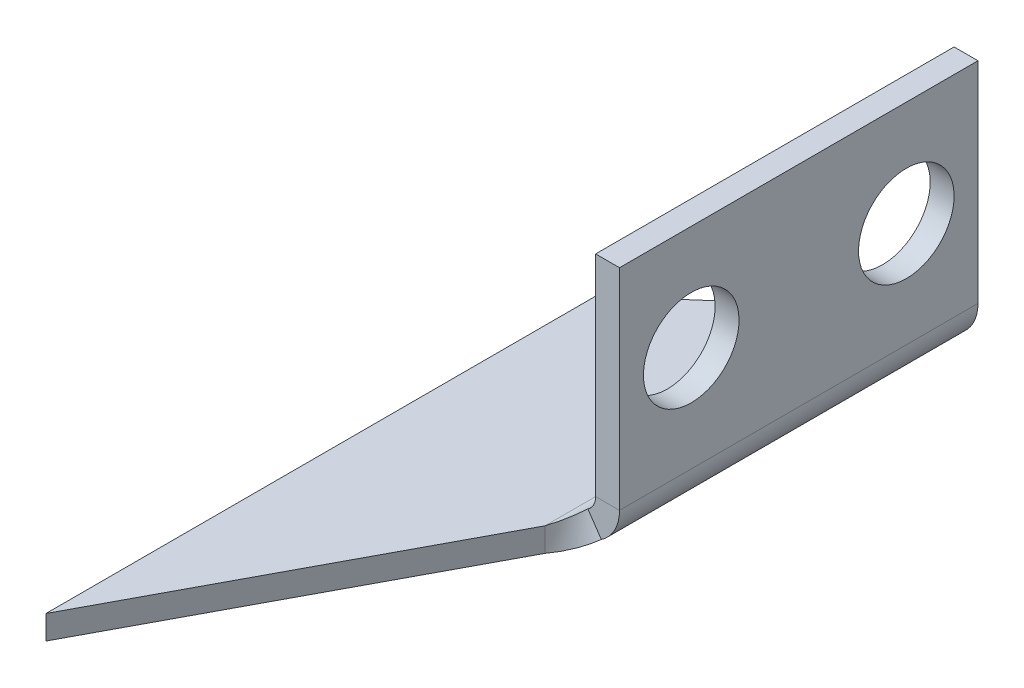
ISO-10303-21;
HEADER;
FILE_DESCRIPTION(('STEP AP214'),'2;1');
FILE_NAME('part.step','',(''),(''),'','','');
FILE_SCHEMA(('AUTOMOTIVE_DESIGN { 1 0 10303 214 1 1 1 1 }'));
ENDSEC;
DATA;
#1=APPLICATION_CONTEXT('core data for automotive mechanical design processes');
#2=APPLICATION_PROTOCOL_DEFINITION('international standard','automotive_design',2000,#1);
#3=PRODUCT_CONTEXT('',#1,'mechanical');
#4=PRODUCT('Part','Part','',(#3));
#5=PRODUCT_RELATED_PRODUCT_CATEGORY('part','',(#4));
#6=PRODUCT_DEFINITION_FORMATION('','',#4);
#7=PRODUCT_DEFINITION_CONTEXT('part definition',#1,'design');
#8=PRODUCT_DEFINITION('design','',#6,#7);
#9=PRODUCT_DEFINITION_SHAPE('','',#8);
#10=(LENGTH_UNIT() NAMED_UNIT(*) SI_UNIT(.MILLI.,.METRE.));
#11=(NAMED_UNIT(*) PLANE_ANGLE_UNIT() SI_UNIT($,.RADIAN.));
#12=(NAMED_UNIT(*) SI_UNIT($,.STERADIAN.) SOLID_ANGLE_UNIT());
#13=UNCERTAINTY_MEASURE_WITH_UNIT(LENGTH_MEASURE(1.E-05),#10,'distance_accuracy_value','');
#14=(GEOMETRIC_REPRESENTATION_CONTEXT(3) GLOBAL_UNCERTAINTY_ASSIGNED_CONTEXT((#13)) GLOBAL_UNIT_ASSIGNED_CONTEXT((#10,
#11,#12)) REPRESENTATION_CONTEXT('',''));
#15=CARTESIAN_POINT('',(0.,0.,0.));
#16=DIRECTION('',(0.,0.,1.));
#17=DIRECTION('',(1.,0.,0.));
#18=AXIS2_PLACEMENT_3D('',#15,#16,#17);
#19=CARTESIAN_POINT('',(1.00000000000001,-0.469246737714571,0.));
#20=DIRECTION('',(-1.,0.,0.));
#21=DIRECTION('',(0.,0.,1.));
#22=AXIS2_PLACEMENT_3D('',#19,#20,#21);
#23=PLANE('',#22);
#24=CARTESIAN_POINT('',(0.999999999999987,5.13367663114272,3.));
#25=DIRECTION('',(-1.,0.,0.));
#26=DIRECTION('',(0.,-1.,0.));
#27=AXIS2_PLACEMENT_3D('',#24,#25,#26);
#28=CIRCLE('',#27,2.);
#29=CARTESIAN_POINT('',(0.999999999999994,3.13367663114271,3.));
#30=VERTEX_POINT('',#29);
#31=EDGE_CURVE('E403',#30,#30,#28,.T.);
#32=ORIENTED_EDGE('',*,*,#31,.T.);
#33=EDGE_LOOP('',(#32));
#34=FACE_BOUND('',#33,.T.);
#35=CARTESIAN_POINT('',(0.999999999999987,5.13367663114272,12.));
#36=DIRECTION('',(-1.,0.,0.));
#37=DIRECTION('',(0.,-1.,0.));
#38=AXIS2_PLACEMENT_3D('',#35,#36,#37);
#39=CIRCLE('',#38,2.);
#40=CARTESIAN_POINT('',(0.999999999999994,3.13367663114272,12.));
#41=VERTEX_POINT('',#40);
#42=EDGE_CURVE('E406',#41,#41,#39,.T.);
#43=ORIENTED_EDGE('',*,*,#42,.T.);
#44=EDGE_LOOP('',(#43));
#45=FACE_BOUND('',#44,.T.);
#46=DIRECTION('',(0.,1.,0.));
#47=VECTOR('',#46,1.);
#48=CARTESIAN_POINT('',(1.00000000000001,-0.46924673771457,15.));
#49=LINE('',#48,#47);
#50=CARTESIAN_POINT('',(1.,0.736600000000008,15.));
#51=VERTEX_POINT('',#50);
#52=CARTESIAN_POINT('',(0.999999999999972,9.53075326228543,15.));
#53=VERTEX_POINT('',#52);
#54=EDGE_CURVE('E65',#51,#53,#49,.T.);
#55=ORIENTED_EDGE('',*,*,#54,.F.);
#56=DIRECTION('',(0.,0.,-1.));
#57=VECTOR('',#56,1.);
#58=CARTESIAN_POINT('',(1.,0.736600000000005,0.));
#59=LINE('',#58,#57);
#60=CARTESIAN_POINT('',(1.,0.736600000000004,0.));
#61=VERTEX_POINT('',#60);
#62=EDGE_CURVE('E105',#51,#61,#59,.T.);
#63=ORIENTED_EDGE('',*,*,#62,.T.);
#64=DIRECTION('',(0.,-1.,0.));
#65=VECTOR('',#64,1.);
#66=CARTESIAN_POINT('',(0.999999999999972,9.53075326228543,0.));
#67=LINE('',#66,#65);
#68=CARTESIAN_POINT('',(0.999999999999972,9.53075326228543,0.));
#69=VERTEX_POINT('',#68);
#70=EDGE_CURVE('E120',#69,#61,#67,.T.);
#71=ORIENTED_EDGE('',*,*,#70,.F.);
#72=DIRECTION('',(0.,0.,-1.));
#73=VECTOR('',#72,1.);
#74=CARTESIAN_POINT('',(0.999999999999972,9.53075326228543,15.));
#75=LINE('',#74,#73);
#76=EDGE_CURVE('E104',#53,#69,#75,.T.);
#77=ORIENTED_EDGE('',*,*,#76,.F.);
#78=EDGE_LOOP('',(#55,#63,#71,#77));
#79=FACE_BOUND('',#78,.T.);
#80=ADVANCED_FACE('F61',(#34,#45,#79),#23,.F.);
#81=CARTESIAN_POINT('',(0.999999999999972,9.53075326228543,0.));
#82=DIRECTION('',(0.,0.,-1.));
#83=DIRECTION('',(0.,-1.,0.));
#84=AXIS2_PLACEMENT_3D('',#81,#82,#83);
#85=PLANE('',#84);
#86=DIRECTION('',(1.,0.,0.));
#87=VECTOR('',#86,1.);
#88=CARTESIAN_POINT('',(1.,0.736600000000004,0.));
#89=LINE('',#88,#87);
#90=CARTESIAN_POINT('',(0.,0.736600000000003,0.));
#91=VERTEX_POINT('',#90);
#92=EDGE_CURVE('E12',#91,#61,#89,.T.);
#93=ORIENTED_EDGE('',*,*,#92,.F.);
#94=DIRECTION('',(0.,-1.,0.));
#95=VECTOR('',#94,1.);
#96=CARTESIAN_POINT('',(0.,9.53075326228543,0.));
#97=LINE('',#96,#95);
#98=CARTESIAN_POINT('',(0.,9.53075326228543,0.));
#99=VERTEX_POINT('',#98);
#100=EDGE_CURVE('E110',#99,#91,#97,.T.);
#101=ORIENTED_EDGE('',*,*,#100,.F.);
#102=DIRECTION('',(-1.,0.,0.));
#103=VECTOR('',#102,1.);
#104=CARTESIAN_POINT('',(0.999999999999972,9.53075326228543,0.));
#105=LINE('',#104,#103);
#106=EDGE_CURVE('E86',#69,#99,#105,.T.);
#107=ORIENTED_EDGE('',*,*,#106,.F.);
#108=ORIENTED_EDGE('',*,*,#70,.T.);
#109=EDGE_LOOP('',(#93,#101,#107,#108));
#110=FACE_BOUND('',#109,.T.);
#111=ADVANCED_FACE('F63',(#110),#85,.T.);
#112=CARTESIAN_POINT('',(0.999999999999972,9.53075326228543,15.));
#113=DIRECTION('',(0.,1.,0.));
#114=DIRECTION('',(0.,0.,-1.));
#115=AXIS2_PLACEMENT_3D('',#112,#113,#114);
#116=PLANE('',#115);
#117=DIRECTION('',(0.,0.,-1.));
#118=VECTOR('',#117,1.);
#119=CARTESIAN_POINT('',(0.,9.53075326228543,15.));
#120=LINE('',#119,#118);
#121=CARTESIAN_POINT('',(0.,9.53075326228543,15.));
#122=VERTEX_POINT('',#121);
#123=EDGE_CURVE('E102',#122,#99,#120,.T.);
#124=ORIENTED_EDGE('',*,*,#123,.F.);
#125=DIRECTION('',(-1.,0.,0.));
#126=VECTOR('',#125,1.);
#127=CARTESIAN_POINT('',(0.999999999999972,9.53075326228543,15.));
#128=LINE('',#127,#126);
#129=EDGE_CURVE('E106',#53,#122,#128,.T.);
#130=ORIENTED_EDGE('',*,*,#129,.F.);
#131=ORIENTED_EDGE('',*,*,#76,.T.);
#132=ORIENTED_EDGE('',*,*,#106,.T.);
#133=EDGE_LOOP('',(#124,#130,#131,#132));
#134=FACE_BOUND('',#133,.T.);
#135=ADVANCED_FACE('F99',(#134),#116,.T.);
#136=CARTESIAN_POINT('',(1.00000000000001,-0.46924673771457,15.));
#137=DIRECTION('',(0.,0.,1.));
#138=DIRECTION('',(0.,1.,0.));
#139=AXIS2_PLACEMENT_3D('',#136,#137,#138);
#140=PLANE('',#139);
#141=DIRECTION('',(-1.,0.,0.));
#142=VECTOR('',#141,1.);
#143=CARTESIAN_POINT('',(1.,0.736600000000006,15.));
#144=LINE('',#143,#142);
#145=CARTESIAN_POINT('',(0.,0.736600000000003,15.));
#146=VERTEX_POINT('',#145);
#147=EDGE_CURVE('E129',#51,#146,#144,.T.);
#148=ORIENTED_EDGE('',*,*,#147,.F.);
#149=ORIENTED_EDGE('',*,*,#54,.T.);
#150=ORIENTED_EDGE('',*,*,#129,.T.);
#151=DIRECTION('',(0.,1.,0.));
#152=VECTOR('',#151,1.);
#153=CARTESIAN_POINT('',(0.,-0.469246737714574,15.));
#154=LINE('',#153,#152);
#155=EDGE_CURVE('E114',#146,#122,#154,.T.);
#156=ORIENTED_EDGE('',*,*,#155,.F.);
#157=EDGE_LOOP('',(#148,#149,#150,#156));
#158=FACE_BOUND('',#157,.T.);
#159=ADVANCED_FACE('F385',(#158),#140,.T.);
#160=CARTESIAN_POINT('',(0.,-0.469246737714574,0.));
#161=DIRECTION('',(-1.,0.,0.));
#162=DIRECTION('',(0.,0.,1.));
#163=AXIS2_PLACEMENT_3D('',#160,#161,#162);
#164=PLANE('',#163);
#165=CARTESIAN_POINT('',(0.,5.13367663114271,3.));
#166=DIRECTION('',(-1.,0.,0.));
#167=DIRECTION('',(0.,-1.,0.));
#168=AXIS2_PLACEMENT_3D('',#165,#166,#167);
#169=CIRCLE('',#168,2.);
#170=CARTESIAN_POINT('',(0.,3.13367663114271,3.));
#171=VERTEX_POINT('',#170);
#172=EDGE_CURVE('E408',#171,#171,#169,.T.);
#173=ORIENTED_EDGE('',*,*,#172,.F.);
#174=EDGE_LOOP('',(#173));
#175=FACE_BOUND('',#174,.T.);
#176=CARTESIAN_POINT('',(0.,5.13367663114271,12.));
#177=DIRECTION('',(-1.,0.,0.));
#178=DIRECTION('',(0.,-1.,0.));
#179=AXIS2_PLACEMENT_3D('',#176,#177,#178);
#180=CIRCLE('',#179,2.);
#181=CARTESIAN_POINT('',(0.,3.13367663114271,12.));
#182=VERTEX_POINT('',#181);
#183=EDGE_CURVE('E412',#182,#182,#180,.T.);
#184=ORIENTED_EDGE('',*,*,#183,.F.);
#185=EDGE_LOOP('',(#184));
#186=FACE_BOUND('',#185,.T.);
#187=DIRECTION('',(0.,0.,-1.));
#188=VECTOR('',#187,1.);
#189=CARTESIAN_POINT('',(0.,0.736600000000002,0.));
#190=LINE('',#189,#188);
#191=EDGE_CURVE('E70',#146,#91,#190,.T.);
#192=ORIENTED_EDGE('',*,*,#191,.F.);
#193=ORIENTED_EDGE('',*,*,#155,.T.);
#194=ORIENTED_EDGE('',*,*,#123,.T.);
#195=ORIENTED_EDGE('',*,*,#100,.T.);
#196=EDGE_LOOP('',(#192,#193,#194,#195));
#197=FACE_BOUND('',#196,.T.);
#198=ADVANCED_FACE('F117',(#175,#186,#197),#164,.T.);
#199=CARTESIAN_POINT('',(-8.,-1.,30.));
#200=DIRECTION('',(-1.,0.,0.));
#201=DIRECTION('',(0.,0.,1.));
#202=AXIS2_PLACEMENT_3D('',#199,#200,#201);
#203=PLANE('',#202);
#204=DIRECTION('',(0.,0.,1.));
#205=VECTOR('',#204,1.);
#206=CARTESIAN_POINT('',(-8.,0.,30.));
#207=LINE('',#206,#205);
#208=CARTESIAN_POINT('',(-8.,0.,7.));
#209=VERTEX_POINT('',#208);
#210=CARTESIAN_POINT('',(-8.,0.,30.));
#211=VERTEX_POINT('',#210);
#212=EDGE_CURVE('E277',#209,#211,#207,.T.);
#213=ORIENTED_EDGE('',*,*,#212,.F.);
#214=DIRECTION('',(0.,1.,0.));
#215=VECTOR('',#214,1.);
#216=CARTESIAN_POINT('',(-8.,-1.,7.));
#217=LINE('',#216,#215);
#218=CARTESIAN_POINT('',(-8.,-1.,7.));
#219=VERTEX_POINT('',#218);
#220=EDGE_CURVE('E115',#219,#209,#217,.T.);
#221=ORIENTED_EDGE('',*,*,#220,.F.);
#222=DIRECTION('',(0.,0.,1.));
#223=VECTOR('',#222,1.);
#224=CARTESIAN_POINT('',(-8.,-1.,7.));
#225=LINE('',#224,#223);
#226=CARTESIAN_POINT('',(-8.,-1.,30.));
#227=VERTEX_POINT('',#226);
#228=EDGE_CURVE('E286',#219,#227,#225,.T.);
#229=ORIENTED_EDGE('',*,*,#228,.T.);
#230=DIRECTION('',(0.,1.,0.));
#231=VECTOR('',#230,1.);
#232=CARTESIAN_POINT('',(-8.,-1.,30.));
#233=LINE('',#232,#231);
#234=EDGE_CURVE('E282',#227,#211,#233,.T.);
#235=ORIENTED_EDGE('',*,*,#234,.T.);
#236=EDGE_LOOP('',(#213,#221,#229,#235));
#237=FACE_BOUND('',#236,.T.);
#238=ADVANCED_FACE('F263',(#237),#203,.T.);
#239=CARTESIAN_POINT('',(0.,-1.,0.));
#240=DIRECTION('',(0.,1.,0.));
#241=DIRECTION('',(0.,0.,1.));
#242=AXIS2_PLACEMENT_3D('',#239,#240,#241);
#243=PLANE('',#242);
#244=DIRECTION('',(0.,0.,-1.));
#245=VECTOR('',#244,1.);
#246=CARTESIAN_POINT('',(-0.736599999999997,-1.,0.));
#247=LINE('',#246,#245);
#248=CARTESIAN_POINT('',(-0.736599999999999,-1.,16.381125));
#249=VERTEX_POINT('',#248);
#250=CARTESIAN_POINT('',(-0.736599999999997,-1.,0.644524999999996));
#251=VERTEX_POINT('',#250);
#252=EDGE_CURVE('E289',#249,#251,#247,.T.);
#253=ORIENTED_EDGE('',*,*,#252,.F.);
#254=DIRECTION('',(0.470588235294118,0.,-0.882352941176471));
#255=VECTOR('',#254,1.);
#256=CARTESIAN_POINT('',(0.,-1.,15.));
#257=LINE('',#256,#255);
#258=EDGE_CURVE('E285',#227,#249,#257,.T.);
#259=ORIENTED_EDGE('',*,*,#258,.F.);
#260=ORIENTED_EDGE('',*,*,#228,.F.);
#261=DIRECTION('',(-0.752576694706878,0.,0.658504607868518));
#262=VECTOR('',#261,1.);
#263=CARTESIAN_POINT('',(0.,-1.,0.));
#264=LINE('',#263,#262);
#265=EDGE_CURVE('E276',#251,#219,#264,.T.);
#266=ORIENTED_EDGE('',*,*,#265,.F.);
#267=EDGE_LOOP('',(#253,#259,#260,#266));
#268=FACE_BOUND('',#267,.T.);
#269=ADVANCED_FACE('F320',(#268),#243,.F.);
#270=CARTESIAN_POINT('',(0.,-1.,15.));
#271=DIRECTION('',(0.882352941176471,0.,0.470588235294118));
#272=DIRECTION('',(0.470588235294118,0.,-0.882352941176471));
#273=AXIS2_PLACEMENT_3D('',#270,#271,#272);
#274=PLANE('',#273);
#275=ORIENTED_EDGE('',*,*,#258,.T.);
#276=CARTESIAN_POINT('',(-0.736599999999998,0.,16.381125));
#277=CARTESIAN_POINT('',(-0.736599999999999,-1.,16.381125));
#278=B_SPLINE_CURVE_WITH_KNOTS('',1,(#276,#277),.UNSPECIFIED.,.F.,.F.,(2,2),(0.,1.),.UNSPECIFIED.);
#279=CARTESIAN_POINT('',(-0.736599999999999,0.,16.381125));
#280=VERTEX_POINT('',#279);
#281=EDGE_CURVE('E228',#249,#280,#278,.F.);
#282=ORIENTED_EDGE('',*,*,#281,.T.);
#283=DIRECTION('',(0.470588235294118,0.,-0.882352941176471));
#284=VECTOR('',#283,1.);
#285=CARTESIAN_POINT('',(0.,0.,15.));
#286=LINE('',#285,#284);
#287=EDGE_CURVE('E293',#211,#280,#286,.T.);
#288=ORIENTED_EDGE('',*,*,#287,.F.);
#289=ORIENTED_EDGE('',*,*,#234,.F.);
#290=EDGE_LOOP('',(#275,#282,#288,#289));
#291=FACE_BOUND('',#290,.T.);
#292=ADVANCED_FACE('F310',(#291),#274,.T.);
#293=CARTESIAN_POINT('',(0.,0.,0.));
#294=DIRECTION('',(0.,1.,0.));
#295=DIRECTION('',(0.,0.,1.));
#296=AXIS2_PLACEMENT_3D('',#293,#294,#295);
#297=PLANE('',#296);
#298=ORIENTED_EDGE('',*,*,#287,.T.);
#299=DIRECTION('',(0.,0.,-1.));
#300=VECTOR('',#299,1.);
#301=CARTESIAN_POINT('',(-0.736599999999997,0.,0.));
#302=LINE('',#301,#300);
#303=CARTESIAN_POINT('',(-0.736599999999998,0.,0.644524999999996));
#304=VERTEX_POINT('',#303);
#305=EDGE_CURVE('E290',#280,#304,#302,.T.);
#306=ORIENTED_EDGE('',*,*,#305,.T.);
#307=DIRECTION('',(-0.752576694706878,0.,0.658504607868518));
#308=VECTOR('',#307,1.);
#309=CARTESIAN_POINT('',(0.,0.,0.));
#310=LINE('',#309,#308);
#311=EDGE_CURVE('E281',#304,#209,#310,.T.);
#312=ORIENTED_EDGE('',*,*,#311,.T.);
#313=ORIENTED_EDGE('',*,*,#212,.T.);
#314=EDGE_LOOP('',(#298,#306,#312,#313));
#315=FACE_BOUND('',#314,.T.);
#316=ADVANCED_FACE('F319',(#315),#297,.T.);
#317=CARTESIAN_POINT('',(0.,-1.,0.));
#318=DIRECTION('',(-0.658504607868518,0.,-0.752576694706878));
#319=DIRECTION('',(-0.752576694706878,0.,0.658504607868518));
#320=AXIS2_PLACEMENT_3D('',#317,#318,#319);
#321=PLANE('',#320);
#322=ORIENTED_EDGE('',*,*,#311,.F.);
#323=CARTESIAN_POINT('',(-0.736599999999998,-1.,0.644524999999996));
#324=CARTESIAN_POINT('',(-0.736599999999998,0.,0.644524999999996));
#325=B_SPLINE_CURVE_WITH_KNOTS('',1,(#323,#324),.UNSPECIFIED.,.F.,.F.,(2,2),(0.,1.),.UNSPECIFIED.);
#326=EDGE_CURVE('E280',#304,#251,#325,.F.);
#327=ORIENTED_EDGE('',*,*,#326,.T.);
#328=ORIENTED_EDGE('',*,*,#265,.T.);
#329=ORIENTED_EDGE('',*,*,#220,.T.);
#330=EDGE_LOOP('',(#322,#327,#328,#329));
#331=FACE_BOUND('',#330,.T.);
#332=ADVANCED_FACE('F258',(#331),#321,.T.);
#333=CARTESIAN_POINT('',(-0.736599999999998,0.7366,15.));
#334=DIRECTION('',(0.,0.,1.));
#335=DIRECTION('',(1.,0.,0.));
#336=AXIS2_PLACEMENT_3D('',#333,#334,#335);
#337=PLANE('',#336);
#338=ORIENTED_EDGE('',*,*,#147,.T.);
#339=CARTESIAN_POINT('',(-0.736599999999998,0.7366,15.));
#340=DIRECTION('',(0.,0.,1.));
#341=DIRECTION('',(1.,0.,0.));
#342=AXIS2_PLACEMENT_3D('',#339,#340,#341);
#343=CIRCLE('',#342,0.7366);
#344=CARTESIAN_POINT('',(-0.32332335740039,0.126860730572817,15.));
#345=VERTEX_POINT('',#344);
#346=EDGE_CURVE('E144',#146,#345,#343,.F.);
#347=ORIENTED_EDGE('',*,*,#346,.T.);
#348=CARTESIAN_POINT('',(0.237736434344938,-0.700914546955263,15.));
#349=CARTESIAN_POINT('',(-0.32332335740039,0.126860730572817,15.));
#350=B_SPLINE_CURVE_WITH_KNOTS('',1,(#348,#349),.UNSPECIFIED.,.F.,.F.,(2,2),(0.,1.),.UNSPECIFIED.);
#351=CARTESIAN_POINT('',(0.237736434344938,-0.700914546955263,15.));
#352=VERTEX_POINT('',#351);
#353=EDGE_CURVE('E244',#345,#352,#350,.F.);
#354=ORIENTED_EDGE('',*,*,#353,.T.);
#355=CARTESIAN_POINT('',(-0.736599999999998,0.7366,15.));
#356=DIRECTION('',(0.,0.,-1.));
#357=DIRECTION('',(1.,0.,0.));
#358=AXIS2_PLACEMENT_3D('',#355,#356,#357);
#359=CIRCLE('',#358,1.7366);
#360=EDGE_CURVE('E153',#51,#352,#359,.T.);
#361=ORIENTED_EDGE('',*,*,#360,.F.);
#362=EDGE_LOOP('',(#338,#347,#354,#361));
#363=FACE_BOUND('',#362,.T.);
#364=ADVANCED_FACE('F249',(#363),#337,.T.);
#365=CARTESIAN_POINT('',(0.237736434344938,-0.700914546955263,15.));
#366=CARTESIAN_POINT('',(-0.0480171034680711,-0.89459612306445,15.4609033682581));
#367=CARTESIAN_POINT('',(-0.391393341175477,-1.,15.9202216317419));
#368=CARTESIAN_POINT('',(-0.736599999999999,-1.,16.381125));
#369=CARTESIAN_POINT('',(-0.32332335740039,0.126860730572817,15.));
#370=CARTESIAN_POINT('',(-0.444430397226399,0.0447752994319123,15.4605276784623));
#371=CARTESIAN_POINT('',(-0.590295751596177,0.,15.9205973215377));
#372=CARTESIAN_POINT('',(-0.736599999999998,0.,16.381125));
#373=B_SPLINE_SURFACE_WITH_KNOTS('',1,3,((#365,#366,#367,#368),(#369,#370,#371,#372)),
.UNSPECIFIED.,.F.,.F.,.F.,(2,2),(4,4),(0.,1.),(0.,1.),.UNSPECIFIED.);
#374=CARTESIAN_POINT('',(-0.32332335740039,0.126860730572817,15.));
#375=CARTESIAN_POINT('',(-0.444430397226399,0.0447752994319123,15.4605276784623));
#376=CARTESIAN_POINT('',(-0.590295751596177,0.,15.9205973215377));
#377=CARTESIAN_POINT('',(-0.736599999999998,0.,16.381125));
#378=B_SPLINE_CURVE_WITH_KNOTS('',3,(#374,#375,#376,#377),.UNSPECIFIED.,.F.,.F.,(4,4),(0.,1.),.UNSPECIFIED.);
#379=EDGE_CURVE('E159',#345,#280,#378,.T.);
#380=CARTESIAN_POINT('',(-0.736599999999999,-1.,16.381125));
#381=CARTESIAN_POINT('',(-0.391393341175477,-1.,15.9202216317419));
#382=CARTESIAN_POINT('',(-0.0480171034680711,-0.89459612306445,15.4609033682581));
#383=CARTESIAN_POINT('',(0.237736434344938,-0.700914546955263,15.));
#384=B_SPLINE_CURVE_WITH_KNOTS('',3,(#380,#381,#382,#383),.UNSPECIFIED.,.F.,.F.,(4,4),(0.,1.),.UNSPECIFIED.);
#385=EDGE_CURVE('E157',#352,#249,#384,.F.);
#386=ORIENTED_EDGE('',*,*,#353,.F.);
#387=ORIENTED_EDGE('',*,*,#379,.T.);
#388=ORIENTED_EDGE('',*,*,#281,.F.);
#389=ORIENTED_EDGE('',*,*,#385,.F.);
#390=EDGE_LOOP('',(#386,#387,#388,#389));
#391=FACE_BOUND('',#390,.T.);
#392=ADVANCED_FACE('F191',(#391),#373,.T.);
#393=CARTESIAN_POINT('',(-0.736599999999998,-1.,0.644524999999996));
#394=CARTESIAN_POINT('',(-0.391104097462943,-1.,0.429256542126764));
#395=CARTESIAN_POINT('',(-0.0482565322624871,-0.894758406081568,0.215268457873233));
#396=CARTESIAN_POINT('',(0.237736434344938,-0.700914546955264,0.));
#397=CARTESIAN_POINT('',(-0.736599999999998,0.,0.644524999999996));
#398=CARTESIAN_POINT('',(-0.590193524151937,0.,0.429461916875509));
#399=CARTESIAN_POINT('',(-0.444515018577426,0.0447179437233359,0.215063083124488));
#400=CARTESIAN_POINT('',(-0.32332335740039,0.126860730572816,0.));
#401=B_SPLINE_SURFACE_WITH_KNOTS('',1,3,((#393,#394,#395,#396),(#397,#398,#399,#400)),
.UNSPECIFIED.,.F.,.F.,.F.,(2,2),(4,4),(0.,1.),(0.,1.),.UNSPECIFIED.);
#402=CARTESIAN_POINT('',(-0.736599999999998,0.,0.644524999999996));
#403=CARTESIAN_POINT('',(-0.590193524151937,0.,0.429461916875509));
#404=CARTESIAN_POINT('',(-0.444515018577426,0.0447179437233359,0.215063083124488));
#405=CARTESIAN_POINT('',(-0.32332335740039,0.126860730572816,0.));
#406=B_SPLINE_CURVE_WITH_KNOTS('',3,(#402,#403,#404,#405),.UNSPECIFIED.,.F.,.F.,(4,4),(0.,1.),.UNSPECIFIED.);
#407=CARTESIAN_POINT('',(-0.32332335740039,0.126860730572816,0.));
#408=VERTEX_POINT('',#407);
#409=EDGE_CURVE('E154',#304,#408,#406,.T.);
#410=CARTESIAN_POINT('',(-0.32332335740039,0.126860730572816,0.));
#411=CARTESIAN_POINT('',(0.237736434344938,-0.700914546955264,0.));
#412=B_SPLINE_CURVE_WITH_KNOTS('',1,(#410,#411),.UNSPECIFIED.,.F.,.F.,(2,2),(0.,1.),.UNSPECIFIED.);
#413=CARTESIAN_POINT('',(0.237736434344938,-0.700914546955264,0.));
#414=VERTEX_POINT('',#413);
#415=EDGE_CURVE('E150',#408,#414,#412,.T.);
#416=CARTESIAN_POINT('',(0.237736434344938,-0.700914546955264,0.));
#417=CARTESIAN_POINT('',(-0.0482565322624871,-0.894758406081568,0.215268457873233));
#418=CARTESIAN_POINT('',(-0.391104097462943,-1.,0.429256542126764));
#419=CARTESIAN_POINT('',(-0.736599999999998,-1.,0.644524999999996));
#420=B_SPLINE_CURVE_WITH_KNOTS('',3,(#416,#417,#418,#419),.UNSPECIFIED.,.F.,.F.,(4,4),(0.,1.),.UNSPECIFIED.);
#421=EDGE_CURVE('E173',#251,#414,#420,.F.);
#422=ORIENTED_EDGE('',*,*,#326,.F.);
#423=ORIENTED_EDGE('',*,*,#409,.T.);
#424=ORIENTED_EDGE('',*,*,#415,.T.);
#425=ORIENTED_EDGE('',*,*,#421,.F.);
#426=EDGE_LOOP('',(#422,#423,#424,#425));
#427=FACE_BOUND('',#426,.T.);
#428=ADVANCED_FACE('F180',(#427),#401,.T.);
#429=CARTESIAN_POINT('',(-0.736599999999997,0.7366,0.));
#430=DIRECTION('',(0.,0.,-1.));
#431=DIRECTION('',(-1.,0.,0.));
#432=AXIS2_PLACEMENT_3D('',#429,#430,#431);
#433=PLANE('',#432);
#434=CARTESIAN_POINT('',(-0.736599999999997,0.7366,0.));
#435=DIRECTION('',(0.,0.,1.));
#436=DIRECTION('',(1.,0.,0.));
#437=AXIS2_PLACEMENT_3D('',#434,#435,#436);
#438=CIRCLE('',#437,0.7366);
#439=EDGE_CURVE('E140',#408,#91,#438,.T.);
#440=ORIENTED_EDGE('',*,*,#439,.T.);
#441=ORIENTED_EDGE('',*,*,#92,.T.);
#442=CARTESIAN_POINT('',(-0.736599999999997,0.7366,0.));
#443=DIRECTION('',(0.,0.,1.));
#444=DIRECTION('',(-1.,0.,0.));
#445=AXIS2_PLACEMENT_3D('',#442,#443,#444);
#446=CIRCLE('',#445,1.7366);
#447=EDGE_CURVE('E78',#414,#61,#446,.T.);
#448=ORIENTED_EDGE('',*,*,#447,.F.);
#449=ORIENTED_EDGE('',*,*,#415,.F.);
#450=EDGE_LOOP('',(#440,#441,#448,#449));
#451=FACE_BOUND('',#450,.T.);
#452=ADVANCED_FACE('F148',(#451),#433,.T.);
#453=CARTESIAN_POINT('',(-0.736599999999997,0.7366,-8.01334683725508));
#454=DIRECTION('',(0.,0.,1.));
#455=DIRECTION('',(1.,0.,0.));
#456=AXIS2_PLACEMENT_3D('',#453,#454,#455);
#457=CYLINDRICAL_SURFACE('',#456,1.7366);
#458=ORIENTED_EDGE('',*,*,#421,.T.);
#459=ORIENTED_EDGE('',*,*,#447,.T.);
#460=ORIENTED_EDGE('',*,*,#62,.F.);
#461=ORIENTED_EDGE('',*,*,#360,.T.);
#462=ORIENTED_EDGE('',*,*,#385,.T.);
#463=ORIENTED_EDGE('',*,*,#252,.T.);
#464=EDGE_LOOP('',(#458,#459,#460,#461,#462,#463));
#465=FACE_BOUND('',#464,.T.);
#466=ADVANCED_FACE('F262',(#465),#457,.T.);
#467=CARTESIAN_POINT('',(-0.736599999999997,0.7366,-8.01334683725508));
#468=DIRECTION('',(0.,0.,1.));
#469=DIRECTION('',(1.,0.,0.));
#470=AXIS2_PLACEMENT_3D('',#467,#468,#469);
#471=CYLINDRICAL_SURFACE('',#470,0.7366);
#472=ORIENTED_EDGE('',*,*,#409,.F.);
#473=ORIENTED_EDGE('',*,*,#305,.F.);
#474=ORIENTED_EDGE('',*,*,#379,.F.);
#475=ORIENTED_EDGE('',*,*,#346,.F.);
#476=ORIENTED_EDGE('',*,*,#191,.T.);
#477=ORIENTED_EDGE('',*,*,#439,.F.);
#478=EDGE_LOOP('',(#472,#473,#474,#475,#476,#477));
#479=FACE_BOUND('',#478,.T.);
#480=ADVANCED_FACE('F138',(#479),#471,.F.);
#481=CARTESIAN_POINT('',(1.00002500000002,5.13367663114272,12.));
#482=DIRECTION('',(-1.,0.,0.));
#483=DIRECTION('',(0.,-1.,0.));
#484=AXIS2_PLACEMENT_3D('',#481,#482,#483);
#485=CYLINDRICAL_SURFACE('',#484,2.);
#486=ORIENTED_EDGE('',*,*,#183,.T.);
#487=EDGE_LOOP('',(#486));
#488=FACE_BOUND('',#487,.T.);
#489=ORIENTED_EDGE('',*,*,#42,.F.);
#490=EDGE_LOOP('',(#489));
#491=FACE_BOUND('',#490,.T.);
#492=ADVANCED_FACE('F428',(#488,#491),#485,.F.);
#493=CARTESIAN_POINT('',(1.00002500000002,5.13367663114272,3.));
#494=DIRECTION('',(-1.,0.,0.));
#495=DIRECTION('',(0.,-1.,0.));
#496=AXIS2_PLACEMENT_3D('',#493,#494,#495);
#497=CYLINDRICAL_SURFACE('',#496,2.);
#498=ORIENTED_EDGE('',*,*,#172,.T.);
#499=EDGE_LOOP('',(#498));
#500=FACE_BOUND('',#499,.T.);
#501=ORIENTED_EDGE('',*,*,#31,.F.);
#502=EDGE_LOOP('',(#501));
#503=FACE_BOUND('',#502,.T.);
#504=ADVANCED_FACE('F527',(#500,#503),#497,.F.);
#505=CLOSED_SHELL('',(#80,#111,#135,#159,#198,#238,#269,#292,#316,#332,#364,#392,#428,#452,#466,
#480,#492,#504));
#506=MANIFOLD_SOLID_BREP('B2',#505);
#507=ADVANCED_BREP_SHAPE_REPRESENTATION('',(#18,#506),#14);
#508=SHAPE_DEFINITION_REPRESENTATION(#9,#507);
ENDSEC;
END-ISO-10303-21;
